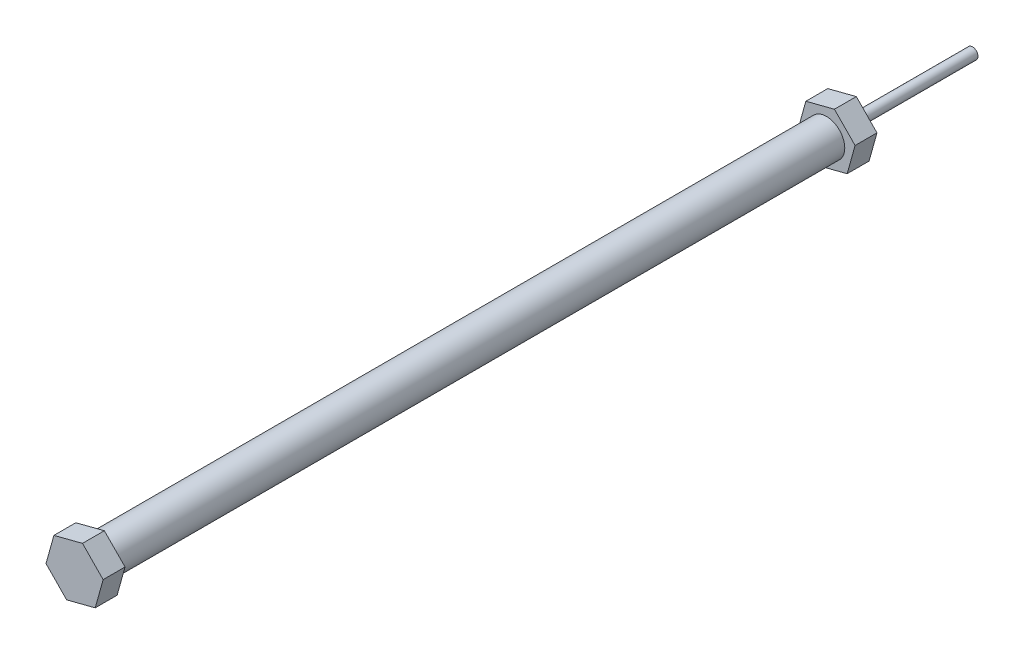
ISO-10303-21;
HEADER;
FILE_DESCRIPTION(('STEP AP214'),'2;1');
FILE_NAME('part.step','',(''),(''),'','','');
FILE_SCHEMA(('AUTOMOTIVE_DESIGN { 1 0 10303 214 1 1 1 1 }'));
ENDSEC;
DATA;
#1=APPLICATION_CONTEXT('core data for automotive mechanical design processes');
#2=APPLICATION_PROTOCOL_DEFINITION('international standard','automotive_design',2000,#1);
#3=PRODUCT_CONTEXT('',#1,'mechanical');
#4=PRODUCT('Part','Part','',(#3));
#5=PRODUCT_RELATED_PRODUCT_CATEGORY('part','',(#4));
#6=PRODUCT_DEFINITION_FORMATION('','',#4);
#7=PRODUCT_DEFINITION_CONTEXT('part definition',#1,'design');
#8=PRODUCT_DEFINITION('design','',#6,#7);
#9=PRODUCT_DEFINITION_SHAPE('','',#8);
#10=(LENGTH_UNIT() NAMED_UNIT(*) SI_UNIT(.MILLI.,.METRE.));
#11=(NAMED_UNIT(*) PLANE_ANGLE_UNIT() SI_UNIT($,.RADIAN.));
#12=(NAMED_UNIT(*) SI_UNIT($,.STERADIAN.) SOLID_ANGLE_UNIT());
#13=UNCERTAINTY_MEASURE_WITH_UNIT(LENGTH_MEASURE(1.E-05),#10,'distance_accuracy_value','');
#14=(GEOMETRIC_REPRESENTATION_CONTEXT(3) GLOBAL_UNCERTAINTY_ASSIGNED_CONTEXT((#13)) GLOBAL_UNIT_ASSIGNED_CONTEXT((#10,
#11,#12)) REPRESENTATION_CONTEXT('',''));
#15=CARTESIAN_POINT('',(0.,0.,0.));
#16=DIRECTION('',(0.,0.,1.));
#17=DIRECTION('',(1.,0.,0.));
#18=AXIS2_PLACEMENT_3D('',#15,#16,#17);
#19=CARTESIAN_POINT('',(0.,0.,100.));
#20=DIRECTION('',(0.,0.,-1.));
#21=DIRECTION('',(-1.,0.,0.));
#22=AXIS2_PLACEMENT_3D('',#19,#20,#21);
#23=CYLINDRICAL_SURFACE('',#22,2.5);
#24=CARTESIAN_POINT('',(0.,0.,100.));
#25=DIRECTION('',(0.,0.,1.));
#26=DIRECTION('',(1.,0.,0.));
#27=AXIS2_PLACEMENT_3D('',#24,#25,#26);
#28=CIRCLE('',#27,2.5);
#29=CARTESIAN_POINT('',(2.5,0.,100.));
#30=VERTEX_POINT('',#29);
#31=EDGE_CURVE('E11',#30,#30,#28,.T.);
#32=ORIENTED_EDGE('',*,*,#31,.F.);
#33=EDGE_LOOP('',(#32));
#34=FACE_BOUND('',#33,.T.);
#35=CARTESIAN_POINT('',(0.,0.,0.));
#36=DIRECTION('',(0.,0.,1.));
#37=DIRECTION('',(1.,0.,0.));
#38=AXIS2_PLACEMENT_3D('',#35,#36,#37);
#39=CIRCLE('',#38,2.5);
#40=CARTESIAN_POINT('',(2.5,0.,0.));
#41=VERTEX_POINT('',#40);
#42=EDGE_CURVE('E43',#41,#41,#39,.T.);
#43=ORIENTED_EDGE('',*,*,#42,.T.);
#44=EDGE_LOOP('',(#43));
#45=FACE_BOUND('',#44,.T.);
#46=ADVANCED_FACE('F34',(#34,#45),#23,.T.);
#47=CARTESIAN_POINT('',(3.91342841928417,1.00916368368683,-3.));
#48=DIRECTION('',(0.713740177468111,0.700410564646044,0.));
#49=DIRECTION('',(-0.700410564646044,0.713740177468111,0.));
#50=AXIS2_PLACEMENT_3D('',#47,#48,#49);
#51=PLANE('',#50);
#52=DIRECTION('',(-0.700410564646044,0.713740177468111,0.));
#53=VECTOR('',#52,1.);
#54=CARTESIAN_POINT('',(3.91342841928417,1.00916368368683,0.));
#55=LINE('',#54,#53);
#56=CARTESIAN_POINT('',(3.91342841928417,1.00916368368683,0.));
#57=VERTEX_POINT('',#56);
#58=CARTESIAN_POINT('',(1.08275282299261,3.89371026883548,0.));
#59=VERTEX_POINT('',#58);
#60=EDGE_CURVE('E127',#57,#59,#55,.T.);
#61=ORIENTED_EDGE('',*,*,#60,.F.);
#62=DIRECTION('',(0.,0.,1.));
#63=VECTOR('',#62,1.);
#64=CARTESIAN_POINT('',(3.91342841928417,1.00916368368683,-3.));
#65=LINE('',#64,#63);
#66=CARTESIAN_POINT('',(3.91342841928417,1.00916368368683,-3.));
#67=VERTEX_POINT('',#66);
#68=EDGE_CURVE('E52',#67,#57,#65,.T.);
#69=ORIENTED_EDGE('',*,*,#68,.F.);
#70=DIRECTION('',(-0.700410564646044,0.713740177468111,0.));
#71=VECTOR('',#70,1.);
#72=CARTESIAN_POINT('',(3.91342841928417,1.00916368368683,-3.));
#73=LINE('',#72,#71);
#74=CARTESIAN_POINT('',(1.08275282299261,3.89371026883548,-3.));
#75=VERTEX_POINT('',#74);
#76=EDGE_CURVE('E143',#67,#75,#73,.T.);
#77=ORIENTED_EDGE('',*,*,#76,.T.);
#78=DIRECTION('',(0.,0.,1.));
#79=VECTOR('',#78,1.);
#80=CARTESIAN_POINT('',(1.08275282299261,3.89371026883548,-3.));
#81=LINE('',#80,#79);
#82=EDGE_CURVE('E88',#75,#59,#81,.T.);
#83=ORIENTED_EDGE('',*,*,#82,.T.);
#84=EDGE_LOOP('',(#61,#69,#77,#83));
#85=FACE_BOUND('',#84,.T.);
#86=ADVANCED_FACE('F158',(#85),#51,.T.);
#87=CARTESIAN_POINT('',(2.83067559629156,-2.88454658514866,-3.));
#88=DIRECTION('',(0.963443430796532,-0.267911843065976,0.));
#89=DIRECTION('',(0.267911843065976,0.963443430796532,0.));
#90=AXIS2_PLACEMENT_3D('',#87,#88,#89);
#91=PLANE('',#90);
#92=DIRECTION('',(0.267911843065976,0.963443430796532,0.));
#93=VECTOR('',#92,1.);
#94=CARTESIAN_POINT('',(2.83067559629156,-2.88454658514866,0.));
#95=LINE('',#94,#93);
#96=CARTESIAN_POINT('',(2.83067559629156,-2.88454658514866,0.));
#97=VERTEX_POINT('',#96);
#98=EDGE_CURVE('E140',#97,#57,#95,.T.);
#99=ORIENTED_EDGE('',*,*,#98,.F.);
#100=DIRECTION('',(0.,0.,1.));
#101=VECTOR('',#100,1.);
#102=CARTESIAN_POINT('',(2.83067559629156,-2.88454658514866,-3.));
#103=LINE('',#102,#101);
#104=CARTESIAN_POINT('',(2.83067559629156,-2.88454658514866,-3.));
#105=VERTEX_POINT('',#104);
#106=EDGE_CURVE('E76',#105,#97,#103,.T.);
#107=ORIENTED_EDGE('',*,*,#106,.F.);
#108=DIRECTION('',(0.267911843065976,0.963443430796532,0.));
#109=VECTOR('',#108,1.);
#110=CARTESIAN_POINT('',(2.83067559629156,-2.88454658514866,-3.));
#111=LINE('',#110,#109);
#112=EDGE_CURVE('E117',#105,#67,#111,.T.);
#113=ORIENTED_EDGE('',*,*,#112,.T.);
#114=ORIENTED_EDGE('',*,*,#68,.T.);
#115=EDGE_LOOP('',(#99,#107,#113,#114));
#116=FACE_BOUND('',#115,.T.);
#117=ADVANCED_FACE('F163',(#116),#91,.T.);
#118=CARTESIAN_POINT('',(-1.08275282299261,-3.89371026883548,-3.));
#119=DIRECTION('',(0.249703253328421,-0.968322407712019,0.));
#120=DIRECTION('',(0.968322407712019,0.249703253328421,0.));
#121=AXIS2_PLACEMENT_3D('',#118,#119,#120);
#122=PLANE('',#121);
#123=DIRECTION('',(0.968322407712019,0.249703253328421,0.));
#124=VECTOR('',#123,1.);
#125=CARTESIAN_POINT('',(-1.08275282299261,-3.89371026883548,0.));
#126=LINE('',#125,#124);
#127=CARTESIAN_POINT('',(-1.08275282299261,-3.89371026883548,0.));
#128=VERTEX_POINT('',#127);
#129=EDGE_CURVE('E104',#128,#97,#126,.T.);
#130=ORIENTED_EDGE('',*,*,#129,.F.);
#131=DIRECTION('',(0.,0.,1.));
#132=VECTOR('',#131,1.);
#133=CARTESIAN_POINT('',(-1.08275282299261,-3.89371026883548,-3.));
#134=LINE('',#133,#132);
#135=CARTESIAN_POINT('',(-1.08275282299261,-3.89371026883548,-3.));
#136=VERTEX_POINT('',#135);
#137=EDGE_CURVE('E99',#136,#128,#134,.T.);
#138=ORIENTED_EDGE('',*,*,#137,.F.);
#139=DIRECTION('',(0.968322407712019,0.249703253328421,0.));
#140=VECTOR('',#139,1.);
#141=CARTESIAN_POINT('',(-1.08275282299261,-3.89371026883548,-3.));
#142=LINE('',#141,#140);
#143=EDGE_CURVE('E102',#136,#105,#142,.T.);
#144=ORIENTED_EDGE('',*,*,#143,.T.);
#145=ORIENTED_EDGE('',*,*,#106,.T.);
#146=EDGE_LOOP('',(#130,#138,#144,#145));
#147=FACE_BOUND('',#146,.T.);
#148=ADVANCED_FACE('F101',(#147),#122,.T.);
#149=CARTESIAN_POINT('',(-3.91342841928416,-1.00916368368683,-3.));
#150=DIRECTION('',(-0.713740177468111,-0.700410564646044,0.));
#151=DIRECTION('',(0.700410564646044,-0.713740177468111,0.));
#152=AXIS2_PLACEMENT_3D('',#149,#150,#151);
#153=PLANE('',#152);
#154=DIRECTION('',(0.700410564646044,-0.713740177468111,0.));
#155=VECTOR('',#154,1.);
#156=CARTESIAN_POINT('',(-3.91342841928416,-1.00916368368683,0.));
#157=LINE('',#156,#155);
#158=CARTESIAN_POINT('',(-3.91342841928416,-1.00916368368683,0.));
#159=VERTEX_POINT('',#158);
#160=EDGE_CURVE('E137',#159,#128,#157,.T.);
#161=ORIENTED_EDGE('',*,*,#160,.F.);
#162=DIRECTION('',(0.,0.,1.));
#163=VECTOR('',#162,1.);
#164=CARTESIAN_POINT('',(-3.91342841928416,-1.00916368368683,-3.));
#165=LINE('',#164,#163);
#166=CARTESIAN_POINT('',(-3.91342841928416,-1.00916368368683,-3.));
#167=VERTEX_POINT('',#166);
#168=EDGE_CURVE('E109',#167,#159,#165,.T.);
#169=ORIENTED_EDGE('',*,*,#168,.F.);
#170=DIRECTION('',(0.700410564646044,-0.713740177468111,0.));
#171=VECTOR('',#170,1.);
#172=CARTESIAN_POINT('',(-3.91342841928416,-1.00916368368683,-3.));
#173=LINE('',#172,#171);
#174=EDGE_CURVE('E115',#167,#136,#173,.T.);
#175=ORIENTED_EDGE('',*,*,#174,.T.);
#176=ORIENTED_EDGE('',*,*,#137,.T.);
#177=EDGE_LOOP('',(#161,#169,#175,#176));
#178=FACE_BOUND('',#177,.T.);
#179=ADVANCED_FACE('F119',(#178),#153,.T.);
#180=CARTESIAN_POINT('',(-2.83067559629156,2.88454658514866,-3.));
#181=DIRECTION('',(-0.963443430796532,0.267911843065975,0.));
#182=DIRECTION('',(-0.267911843065975,-0.963443430796532,0.));
#183=AXIS2_PLACEMENT_3D('',#180,#181,#182);
#184=PLANE('',#183);
#185=DIRECTION('',(-0.267911843065975,-0.963443430796532,0.));
#186=VECTOR('',#185,1.);
#187=CARTESIAN_POINT('',(-2.83067559629156,2.88454658514866,0.));
#188=LINE('',#187,#186);
#189=CARTESIAN_POINT('',(-2.83067559629156,2.88454658514866,0.));
#190=VERTEX_POINT('',#189);
#191=EDGE_CURVE('E134',#190,#159,#188,.T.);
#192=ORIENTED_EDGE('',*,*,#191,.F.);
#193=DIRECTION('',(0.,0.,1.));
#194=VECTOR('',#193,1.);
#195=CARTESIAN_POINT('',(-2.83067559629156,2.88454658514866,-3.));
#196=LINE('',#195,#194);
#197=CARTESIAN_POINT('',(-2.83067559629156,2.88454658514866,-3.));
#198=VERTEX_POINT('',#197);
#199=EDGE_CURVE('E147',#198,#190,#196,.T.);
#200=ORIENTED_EDGE('',*,*,#199,.F.);
#201=DIRECTION('',(-0.267911843065975,-0.963443430796532,0.));
#202=VECTOR('',#201,1.);
#203=CARTESIAN_POINT('',(-2.83067559629156,2.88454658514866,-3.));
#204=LINE('',#203,#202);
#205=EDGE_CURVE('E120',#198,#167,#204,.T.);
#206=ORIENTED_EDGE('',*,*,#205,.T.);
#207=ORIENTED_EDGE('',*,*,#168,.T.);
#208=EDGE_LOOP('',(#192,#200,#206,#207));
#209=FACE_BOUND('',#208,.T.);
#210=ADVANCED_FACE('F162',(#209),#184,.T.);
#211=CARTESIAN_POINT('',(1.08275282299261,3.89371026883548,-3.));
#212=DIRECTION('',(-0.249703253328421,0.968322407712019,0.));
#213=DIRECTION('',(-0.968322407712019,-0.249703253328421,0.));
#214=AXIS2_PLACEMENT_3D('',#211,#212,#213);
#215=PLANE('',#214);
#216=DIRECTION('',(-0.968322407712019,-0.249703253328421,0.));
#217=VECTOR('',#216,1.);
#218=CARTESIAN_POINT('',(1.08275282299261,3.89371026883548,0.));
#219=LINE('',#218,#217);
#220=EDGE_CURVE('E130',#59,#190,#219,.T.);
#221=ORIENTED_EDGE('',*,*,#220,.F.);
#222=ORIENTED_EDGE('',*,*,#82,.F.);
#223=DIRECTION('',(-0.968322407712019,-0.249703253328421,0.));
#224=VECTOR('',#223,1.);
#225=CARTESIAN_POINT('',(1.08275282299261,3.89371026883548,-3.));
#226=LINE('',#225,#224);
#227=EDGE_CURVE('E122',#75,#198,#226,.T.);
#228=ORIENTED_EDGE('',*,*,#227,.T.);
#229=ORIENTED_EDGE('',*,*,#199,.T.);
#230=EDGE_LOOP('',(#221,#222,#228,#229));
#231=FACE_BOUND('',#230,.T.);
#232=ADVANCED_FACE('F159',(#231),#215,.T.);
#233=CARTESIAN_POINT('',(0.,0.,-3.));
#234=DIRECTION('',(0.,0.,1.));
#235=DIRECTION('',(1.,0.,0.));
#236=AXIS2_PLACEMENT_3D('',#233,#234,#235);
#237=PLANE('',#236);
#238=CARTESIAN_POINT('',(0.,0.,-3.));
#239=DIRECTION('',(0.,0.,1.));
#240=DIRECTION('',(1.,0.,0.));
#241=AXIS2_PLACEMENT_3D('',#238,#239,#240);
#242=CIRCLE('',#241,0.75);
#243=CARTESIAN_POINT('',(0.75,0.,-3.));
#244=VERTEX_POINT('',#243);
#245=EDGE_CURVE('E37',#244,#244,#242,.T.);
#246=ORIENTED_EDGE('',*,*,#245,.T.);
#247=EDGE_LOOP('',(#246));
#248=FACE_BOUND('',#247,.T.);
#249=ORIENTED_EDGE('',*,*,#76,.F.);
#250=ORIENTED_EDGE('',*,*,#112,.F.);
#251=ORIENTED_EDGE('',*,*,#143,.F.);
#252=ORIENTED_EDGE('',*,*,#174,.F.);
#253=ORIENTED_EDGE('',*,*,#205,.F.);
#254=ORIENTED_EDGE('',*,*,#227,.F.);
#255=EDGE_LOOP('',(#249,#250,#251,#252,#253,#254));
#256=FACE_BOUND('',#255,.T.);
#257=ADVANCED_FACE('F113',(#248,#256),#237,.F.);
#258=CARTESIAN_POINT('',(0.,0.,0.));
#259=DIRECTION('',(0.,0.,1.));
#260=DIRECTION('',(1.,0.,0.));
#261=AXIS2_PLACEMENT_3D('',#258,#259,#260);
#262=PLANE('',#261);
#263=ORIENTED_EDGE('',*,*,#42,.F.);
#264=EDGE_LOOP('',(#263));
#265=FACE_BOUND('',#264,.T.);
#266=ORIENTED_EDGE('',*,*,#60,.T.);
#267=ORIENTED_EDGE('',*,*,#220,.T.);
#268=ORIENTED_EDGE('',*,*,#191,.T.);
#269=ORIENTED_EDGE('',*,*,#160,.T.);
#270=ORIENTED_EDGE('',*,*,#129,.T.);
#271=ORIENTED_EDGE('',*,*,#98,.T.);
#272=EDGE_LOOP('',(#266,#267,#268,#269,#270,#271));
#273=FACE_BOUND('',#272,.T.);
#274=ADVANCED_FACE('F153',(#265,#273),#262,.T.);
#275=CARTESIAN_POINT('',(3.37205200778786,-0.937691450730914,103.));
#276=DIRECTION('',(0.963443430796532,-0.267911843065976,0.));
#277=DIRECTION('',(0.267911843065976,0.963443430796532,0.));
#278=AXIS2_PLACEMENT_3D('',#275,#276,#277);
#279=PLANE('',#278);
#280=DIRECTION('',(-0.267911843065976,-0.963443430796532,0.));
#281=VECTOR('',#280,1.);
#282=CARTESIAN_POINT('',(3.37205200778786,-0.937691450730914,100.));
#283=LINE('',#282,#281);
#284=CARTESIAN_POINT('',(3.91342841928417,1.00916368368683,100.));
#285=VERTEX_POINT('',#284);
#286=CARTESIAN_POINT('',(2.83067559629156,-2.88454658514865,100.));
#287=VERTEX_POINT('',#286);
#288=EDGE_CURVE('E188',#285,#287,#283,.T.);
#289=ORIENTED_EDGE('',*,*,#288,.F.);
#290=DIRECTION('',(0.,0.,-1.));
#291=VECTOR('',#290,1.);
#292=CARTESIAN_POINT('',(3.91342841928417,1.00916368368683,103.));
#293=LINE('',#292,#291);
#294=CARTESIAN_POINT('',(3.91342841928417,1.00916368368683,103.));
#295=VERTEX_POINT('',#294);
#296=EDGE_CURVE('E131',#295,#285,#293,.T.);
#297=ORIENTED_EDGE('',*,*,#296,.F.);
#298=DIRECTION('',(-0.267911843065976,-0.963443430796532,0.));
#299=VECTOR('',#298,1.);
#300=CARTESIAN_POINT('',(3.37205200778786,-0.937691450730914,103.));
#301=LINE('',#300,#299);
#302=CARTESIAN_POINT('',(2.83067559629156,-2.88454658514865,103.));
#303=VERTEX_POINT('',#302);
#304=EDGE_CURVE('E216',#295,#303,#301,.T.);
#305=ORIENTED_EDGE('',*,*,#304,.T.);
#306=DIRECTION('',(0.,0.,-1.));
#307=VECTOR('',#306,1.);
#308=CARTESIAN_POINT('',(2.83067559629156,-2.88454658514865,103.));
#309=LINE('',#308,#307);
#310=EDGE_CURVE('E231',#303,#287,#309,.T.);
#311=ORIENTED_EDGE('',*,*,#310,.T.);
#312=EDGE_LOOP('',(#289,#297,#305,#311));
#313=FACE_BOUND('',#312,.T.);
#314=ADVANCED_FACE('F156',(#313),#279,.T.);
#315=CARTESIAN_POINT('',(2.49809062113839,2.45143697626115,103.));
#316=DIRECTION('',(0.713740177468111,0.700410564646044,0.));
#317=DIRECTION('',(-0.700410564646044,0.713740177468111,0.));
#318=AXIS2_PLACEMENT_3D('',#315,#316,#317);
#319=PLANE('',#318);
#320=DIRECTION('',(0.700410564646044,-0.713740177468111,0.));
#321=VECTOR('',#320,1.);
#322=CARTESIAN_POINT('',(2.49809062113839,2.45143697626115,100.));
#323=LINE('',#322,#321);
#324=CARTESIAN_POINT('',(1.08275282299261,3.89371026883548,100.));
#325=VERTEX_POINT('',#324);
#326=EDGE_CURVE('E195',#325,#285,#323,.T.);
#327=ORIENTED_EDGE('',*,*,#326,.F.);
#328=DIRECTION('',(0.,0.,-1.));
#329=VECTOR('',#328,1.);
#330=CARTESIAN_POINT('',(1.08275282299261,3.89371026883548,103.));
#331=LINE('',#330,#329);
#332=CARTESIAN_POINT('',(1.08275282299261,3.89371026883548,103.));
#333=VERTEX_POINT('',#332);
#334=EDGE_CURVE('E219',#333,#325,#331,.T.);
#335=ORIENTED_EDGE('',*,*,#334,.F.);
#336=DIRECTION('',(0.700410564646044,-0.713740177468111,0.));
#337=VECTOR('',#336,1.);
#338=CARTESIAN_POINT('',(2.49809062113839,2.45143697626115,103.));
#339=LINE('',#338,#337);
#340=EDGE_CURVE('E206',#333,#295,#339,.T.);
#341=ORIENTED_EDGE('',*,*,#340,.T.);
#342=ORIENTED_EDGE('',*,*,#296,.T.);
#343=EDGE_LOOP('',(#327,#335,#341,#342));
#344=FACE_BOUND('',#343,.T.);
#345=ADVANCED_FACE('F273',(#344),#319,.T.);
#346=CARTESIAN_POINT('',(-0.873961386649474,3.38912842699207,103.));
#347=DIRECTION('',(-0.249703253328421,0.968322407712019,0.));
#348=DIRECTION('',(-0.968322407712019,-0.249703253328421,0.));
#349=AXIS2_PLACEMENT_3D('',#346,#347,#348);
#350=PLANE('',#349);
#351=DIRECTION('',(0.968322407712019,0.249703253328421,0.));
#352=VECTOR('',#351,1.);
#353=CARTESIAN_POINT('',(-0.873961386649474,3.38912842699207,100.));
#354=LINE('',#353,#352);
#355=CARTESIAN_POINT('',(-2.83067559629156,2.88454658514866,100.));
#356=VERTEX_POINT('',#355);
#357=EDGE_CURVE('E213',#356,#325,#354,.T.);
#358=ORIENTED_EDGE('',*,*,#357,.F.);
#359=DIRECTION('',(0.,0.,-1.));
#360=VECTOR('',#359,1.);
#361=CARTESIAN_POINT('',(-2.83067559629156,2.88454658514866,103.));
#362=LINE('',#361,#360);
#363=CARTESIAN_POINT('',(-2.83067559629156,2.88454658514866,103.));
#364=VERTEX_POINT('',#363);
#365=EDGE_CURVE('E222',#364,#356,#362,.T.);
#366=ORIENTED_EDGE('',*,*,#365,.F.);
#367=DIRECTION('',(0.968322407712019,0.249703253328421,0.));
#368=VECTOR('',#367,1.);
#369=CARTESIAN_POINT('',(-0.873961386649474,3.38912842699207,103.));
#370=LINE('',#369,#368);
#371=EDGE_CURVE('E236',#364,#333,#370,.T.);
#372=ORIENTED_EDGE('',*,*,#371,.T.);
#373=ORIENTED_EDGE('',*,*,#334,.T.);
#374=EDGE_LOOP('',(#358,#366,#372,#373));
#375=FACE_BOUND('',#374,.T.);
#376=ADVANCED_FACE('F276',(#375),#350,.T.);
#377=CARTESIAN_POINT('',(-3.37205200778786,0.937691450730914,103.));
#378=DIRECTION('',(-0.963443430796532,0.267911843065975,0.));
#379=DIRECTION('',(-0.267911843065975,-0.963443430796532,0.));
#380=AXIS2_PLACEMENT_3D('',#377,#378,#379);
#381=PLANE('',#380);
#382=DIRECTION('',(0.267911843065975,0.963443430796532,0.));
#383=VECTOR('',#382,1.);
#384=CARTESIAN_POINT('',(-3.37205200778786,0.937691450730914,100.));
#385=LINE('',#384,#383);
#386=CARTESIAN_POINT('',(-3.91342841928416,-1.00916368368683,100.));
#387=VERTEX_POINT('',#386);
#388=EDGE_CURVE('E210',#387,#356,#385,.T.);
#389=ORIENTED_EDGE('',*,*,#388,.F.);
#390=DIRECTION('',(0.,0.,-1.));
#391=VECTOR('',#390,1.);
#392=CARTESIAN_POINT('',(-3.91342841928416,-1.00916368368683,103.));
#393=LINE('',#392,#391);
#394=CARTESIAN_POINT('',(-3.91342841928416,-1.00916368368683,103.));
#395=VERTEX_POINT('',#394);
#396=EDGE_CURVE('E225',#395,#387,#393,.T.);
#397=ORIENTED_EDGE('',*,*,#396,.F.);
#398=DIRECTION('',(0.267911843065975,0.963443430796532,0.));
#399=VECTOR('',#398,1.);
#400=CARTESIAN_POINT('',(-3.37205200778786,0.937691450730914,103.));
#401=LINE('',#400,#399);
#402=EDGE_CURVE('E241',#395,#364,#401,.T.);
#403=ORIENTED_EDGE('',*,*,#402,.T.);
#404=ORIENTED_EDGE('',*,*,#365,.T.);
#405=EDGE_LOOP('',(#389,#397,#403,#404));
#406=FACE_BOUND('',#405,.T.);
#407=ADVANCED_FACE('F279',(#406),#381,.T.);
#408=CARTESIAN_POINT('',(-2.49809062113839,-2.45143697626115,103.));
#409=DIRECTION('',(-0.713740177468111,-0.700410564646044,0.));
#410=DIRECTION('',(0.700410564646044,-0.713740177468111,0.));
#411=AXIS2_PLACEMENT_3D('',#408,#409,#410);
#412=PLANE('',#411);
#413=DIRECTION('',(-0.700410564646044,0.713740177468111,0.));
#414=VECTOR('',#413,1.);
#415=CARTESIAN_POINT('',(-2.49809062113839,-2.45143697626115,100.));
#416=LINE('',#415,#414);
#417=CARTESIAN_POINT('',(-1.08275282299261,-3.89371026883548,100.));
#418=VERTEX_POINT('',#417);
#419=EDGE_CURVE('E201',#418,#387,#416,.T.);
#420=ORIENTED_EDGE('',*,*,#419,.F.);
#421=DIRECTION('',(0.,0.,-1.));
#422=VECTOR('',#421,1.);
#423=CARTESIAN_POINT('',(-1.08275282299261,-3.89371026883548,103.));
#424=LINE('',#423,#422);
#425=CARTESIAN_POINT('',(-1.08275282299261,-3.89371026883548,103.));
#426=VERTEX_POINT('',#425);
#427=EDGE_CURVE('E228',#426,#418,#424,.T.);
#428=ORIENTED_EDGE('',*,*,#427,.F.);
#429=DIRECTION('',(-0.700410564646044,0.713740177468111,0.));
#430=VECTOR('',#429,1.);
#431=CARTESIAN_POINT('',(-2.49809062113839,-2.45143697626115,103.));
#432=LINE('',#431,#430);
#433=EDGE_CURVE('E247',#426,#395,#432,.T.);
#434=ORIENTED_EDGE('',*,*,#433,.T.);
#435=ORIENTED_EDGE('',*,*,#396,.T.);
#436=EDGE_LOOP('',(#420,#428,#434,#435));
#437=FACE_BOUND('',#436,.T.);
#438=ADVANCED_FACE('F282',(#437),#412,.T.);
#439=CARTESIAN_POINT('',(0.873961386649475,-3.38912842699207,103.));
#440=DIRECTION('',(0.249703253328421,-0.968322407712019,0.));
#441=DIRECTION('',(0.968322407712019,0.249703253328421,0.));
#442=AXIS2_PLACEMENT_3D('',#439,#440,#441);
#443=PLANE('',#442);
#444=DIRECTION('',(-0.968322407712019,-0.249703253328421,0.));
#445=VECTOR('',#444,1.);
#446=CARTESIAN_POINT('',(0.873961386649475,-3.38912842699207,100.));
#447=LINE('',#446,#445);
#448=EDGE_CURVE('E192',#287,#418,#447,.T.);
#449=ORIENTED_EDGE('',*,*,#448,.F.);
#450=ORIENTED_EDGE('',*,*,#310,.F.);
#451=DIRECTION('',(-0.968322407712019,-0.249703253328421,0.));
#452=VECTOR('',#451,1.);
#453=CARTESIAN_POINT('',(0.873961386649475,-3.38912842699207,103.));
#454=LINE('',#453,#452);
#455=EDGE_CURVE('E252',#303,#426,#454,.T.);
#456=ORIENTED_EDGE('',*,*,#455,.T.);
#457=ORIENTED_EDGE('',*,*,#427,.T.);
#458=EDGE_LOOP('',(#449,#450,#456,#457));
#459=FACE_BOUND('',#458,.T.);
#460=ADVANCED_FACE('F270',(#459),#443,.T.);
#461=CARTESIAN_POINT('',(0.,0.,103.));
#462=DIRECTION('',(0.,0.,-1.));
#463=DIRECTION('',(-1.,0.,0.));
#464=AXIS2_PLACEMENT_3D('',#461,#462,#463);
#465=PLANE('',#464);
#466=ORIENTED_EDGE('',*,*,#304,.F.);
#467=ORIENTED_EDGE('',*,*,#340,.F.);
#468=ORIENTED_EDGE('',*,*,#371,.F.);
#469=ORIENTED_EDGE('',*,*,#402,.F.);
#470=ORIENTED_EDGE('',*,*,#433,.F.);
#471=ORIENTED_EDGE('',*,*,#455,.F.);
#472=EDGE_LOOP('',(#466,#467,#468,#469,#470,#471));
#473=FACE_BOUND('',#472,.T.);
#474=ADVANCED_FACE('F181',(#473),#465,.F.);
#475=CARTESIAN_POINT('',(0.,0.,100.));
#476=DIRECTION('',(0.,0.,-1.));
#477=DIRECTION('',(-1.,0.,0.));
#478=AXIS2_PLACEMENT_3D('',#475,#476,#477);
#479=PLANE('',#478);
#480=ORIENTED_EDGE('',*,*,#31,.T.);
#481=EDGE_LOOP('',(#480));
#482=FACE_BOUND('',#481,.T.);
#483=ORIENTED_EDGE('',*,*,#288,.T.);
#484=ORIENTED_EDGE('',*,*,#448,.T.);
#485=ORIENTED_EDGE('',*,*,#419,.T.);
#486=ORIENTED_EDGE('',*,*,#388,.T.);
#487=ORIENTED_EDGE('',*,*,#357,.T.);
#488=ORIENTED_EDGE('',*,*,#326,.T.);
#489=EDGE_LOOP('',(#483,#484,#485,#486,#487,#488));
#490=FACE_BOUND('',#489,.T.);
#491=ADVANCED_FACE('F177',(#482,#490),#479,.T.);
#492=CARTESIAN_POINT('',(0.,0.,-20.));
#493=DIRECTION('',(0.,0.,1.));
#494=DIRECTION('',(1.,0.,0.));
#495=AXIS2_PLACEMENT_3D('',#492,#493,#494);
#496=CYLINDRICAL_SURFACE('',#495,0.75);
#497=CARTESIAN_POINT('',(0.,0.,-20.));
#498=DIRECTION('',(0.,0.,1.));
#499=DIRECTION('',(1.,0.,0.));
#500=AXIS2_PLACEMENT_3D('',#497,#498,#499);
#501=CIRCLE('',#500,0.75);
#502=CARTESIAN_POINT('',(0.75,0.,-20.));
#503=VERTEX_POINT('',#502);
#504=EDGE_CURVE('E204',#503,#503,#501,.T.);
#505=ORIENTED_EDGE('',*,*,#504,.T.);
#506=EDGE_LOOP('',(#505));
#507=FACE_BOUND('',#506,.T.);
#508=ORIENTED_EDGE('',*,*,#245,.F.);
#509=EDGE_LOOP('',(#508));
#510=FACE_BOUND('',#509,.T.);
#511=ADVANCED_FACE('F180',(#507,#510),#496,.T.);
#512=CARTESIAN_POINT('',(0.,0.,-20.));
#513=DIRECTION('',(0.,0.,1.));
#514=DIRECTION('',(1.,0.,0.));
#515=AXIS2_PLACEMENT_3D('',#512,#513,#514);
#516=PLANE('',#515);
#517=ORIENTED_EDGE('',*,*,#504,.F.);
#518=EDGE_LOOP('',(#517));
#519=FACE_BOUND('',#518,.T.);
#520=ADVANCED_FACE('F261',(#519),#516,.F.);
#521=CLOSED_SHELL('',(#46,#86,#117,#148,#179,#210,#232,#257,#274,#314,#345,#376,#407,#438,#460,
#474,#491,#511,#520));
#522=MANIFOLD_SOLID_BREP('B2',#521);
#523=ADVANCED_BREP_SHAPE_REPRESENTATION('',(#18,#522),#14);
#524=SHAPE_DEFINITION_REPRESENTATION(#9,#523);
ENDSEC;
END-ISO-10303-21;
